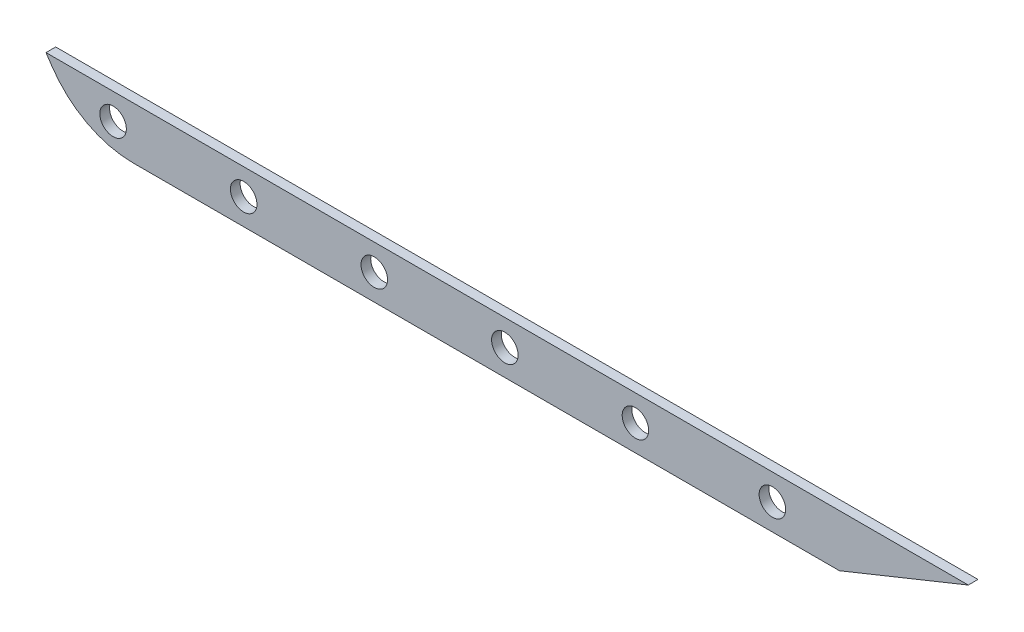
ISO-10303-21;
HEADER;
FILE_DESCRIPTION(('STEP AP214'),'2;1');
FILE_NAME('part.step','',(''),(''),'','','');
FILE_SCHEMA(('AUTOMOTIVE_DESIGN { 1 0 10303 214 1 1 1 1 }'));
ENDSEC;
DATA;
#1=APPLICATION_CONTEXT('core data for automotive mechanical design processes');
#2=APPLICATION_PROTOCOL_DEFINITION('international standard','automotive_design',2000,#1);
#3=PRODUCT_CONTEXT('',#1,'mechanical');
#4=PRODUCT('Part','Part','',(#3));
#5=PRODUCT_RELATED_PRODUCT_CATEGORY('part','',(#4));
#6=PRODUCT_DEFINITION_FORMATION('','',#4);
#7=PRODUCT_DEFINITION_CONTEXT('part definition',#1,'design');
#8=PRODUCT_DEFINITION('design','',#6,#7);
#9=PRODUCT_DEFINITION_SHAPE('','',#8);
#10=(LENGTH_UNIT() NAMED_UNIT(*) SI_UNIT(.MILLI.,.METRE.));
#11=(NAMED_UNIT(*) PLANE_ANGLE_UNIT() SI_UNIT($,.RADIAN.));
#12=(NAMED_UNIT(*) SI_UNIT($,.STERADIAN.) SOLID_ANGLE_UNIT());
#13=UNCERTAINTY_MEASURE_WITH_UNIT(LENGTH_MEASURE(1.E-05),#10,'distance_accuracy_value','');
#14=(GEOMETRIC_REPRESENTATION_CONTEXT(3) GLOBAL_UNCERTAINTY_ASSIGNED_CONTEXT((#13)) GLOBAL_UNIT_ASSIGNED_CONTEXT((#10,
#11,#12)) REPRESENTATION_CONTEXT('',''));
#15=CARTESIAN_POINT('',(0.,0.,0.));
#16=DIRECTION('',(0.,0.,1.));
#17=DIRECTION('',(1.,0.,0.));
#18=AXIS2_PLACEMENT_3D('',#15,#16,#17);
#19=CARTESIAN_POINT('',(-98.8794117647059,3.85098039215685,4.7625));
#20=DIRECTION('',(0.832050294337844,0.554700196225229,0.));
#21=DIRECTION('',(-0.554700196225229,0.832050294337844,0.));
#22=AXIS2_PLACEMENT_3D('',#19,#20,#21);
#23=PLANE('',#22);
#24=DIRECTION('',(0.554700196225229,-0.832050294337844,0.));
#25=VECTOR('',#24,1.);
#26=CARTESIAN_POINT('',(-98.8794117647059,3.85098039215685,0.));
#27=LINE('',#26,#25);
#28=CARTESIAN_POINT('',(-48.8794117647059,-71.1490196078431,0.));
#29=VERTEX_POINT('',#28);
#30=CARTESIAN_POINT('',(-46.1290054854985,-75.2746290266542,0.));
#31=VERTEX_POINT('',#30);
#32=EDGE_CURVE('E156',#29,#31,#27,.T.);
#33=ORIENTED_EDGE('',*,*,#32,.T.);
#34=DIRECTION('',(0.,0.,-1.));
#35=VECTOR('',#34,1.);
#36=CARTESIAN_POINT('',(-46.1290054854985,-75.2746290266542,4.7625));
#37=LINE('',#36,#35);
#38=CARTESIAN_POINT('',(-46.1290054854985,-75.2746290266542,4.7625));
#39=VERTEX_POINT('',#38);
#40=EDGE_CURVE('E49',#31,#39,#37,.F.);
#41=ORIENTED_EDGE('',*,*,#40,.T.);
#42=DIRECTION('',(0.554700196225229,-0.832050294337844,0.));
#43=VECTOR('',#42,1.);
#44=CARTESIAN_POINT('',(-98.8794117647059,3.85098039215685,4.7625));
#45=LINE('',#44,#43);
#46=CARTESIAN_POINT('',(-48.8794117647059,-71.1490196078431,4.7625));
#47=VERTEX_POINT('',#46);
#48=EDGE_CURVE('E98',#47,#39,#45,.T.);
#49=ORIENTED_EDGE('',*,*,#48,.F.);
#50=DIRECTION('',(0.,0.,1.));
#51=VECTOR('',#50,1.);
#52=CARTESIAN_POINT('',(-48.8794117647059,-71.1490196078431,-5.2375));
#53=LINE('',#52,#51);
#54=EDGE_CURVE('E112',#29,#47,#53,.T.);
#55=ORIENTED_EDGE('',*,*,#54,.F.);
#56=EDGE_LOOP('',(#33,#41,#49,#55));
#57=FACE_BOUND('',#56,.T.);
#58=ADVANCED_FACE('F41',(#57),#23,.F.);
#59=CARTESIAN_POINT('',(-31.8794117647059,-96.6490196078432,4.7625));
#60=DIRECTION('',(0.,1.,0.));
#61=DIRECTION('',(-1.,0.,0.));
#62=AXIS2_PLACEMENT_3D('',#59,#60,#61);
#63=PLANE('',#62);
#64=DIRECTION('',(1.,0.,0.));
#65=VECTOR('',#64,1.);
#66=CARTESIAN_POINT('',(-31.8794117647059,-96.6490196078432,0.));
#67=LINE('',#66,#65);
#68=CARTESIAN_POINT('',(-6.19059135728204,-96.6490196078432,0.));
#69=VERTEX_POINT('',#68);
#70=CARTESIAN_POINT('',(340.005873473177,-96.6490196078432,0.));
#71=VERTEX_POINT('',#70);
#72=EDGE_CURVE('E122',#69,#71,#67,.T.);
#73=ORIENTED_EDGE('',*,*,#72,.T.);
#74=DIRECTION('',(0.,0.,1.));
#75=VECTOR('',#74,1.);
#76=CARTESIAN_POINT('',(340.005873473177,-96.6490196078432,-5.2375));
#77=LINE('',#76,#75);
#78=CARTESIAN_POINT('',(340.005873473177,-96.6490196078432,4.7625));
#79=VERTEX_POINT('',#78);
#80=EDGE_CURVE('E108',#71,#79,#77,.T.);
#81=ORIENTED_EDGE('',*,*,#80,.T.);
#82=DIRECTION('',(1.,0.,0.));
#83=VECTOR('',#82,1.);
#84=CARTESIAN_POINT('',(-31.8794117647059,-96.6490196078432,4.7625));
#85=LINE('',#84,#83);
#86=CARTESIAN_POINT('',(-6.19059135728204,-96.6490196078432,4.7625));
#87=VERTEX_POINT('',#86);
#88=EDGE_CURVE('E107',#87,#79,#85,.T.);
#89=ORIENTED_EDGE('',*,*,#88,.F.);
#90=DIRECTION('',(0.,0.,-1.));
#91=VECTOR('',#90,1.);
#92=CARTESIAN_POINT('',(-6.19059135728204,-96.6490196078432,4.7625));
#93=LINE('',#92,#91);
#94=EDGE_CURVE('E162',#87,#69,#93,.T.);
#95=ORIENTED_EDGE('',*,*,#94,.T.);
#96=EDGE_LOOP('',(#73,#81,#89,#95));
#97=FACE_BOUND('',#96,.T.);
#98=ADVANCED_FACE('F167',(#97),#63,.F.);
#99=CARTESIAN_POINT('',(0.,0.,4.7625));
#100=DIRECTION('',(0.,0.,1.));
#101=DIRECTION('',(1.,0.,0.));
#102=AXIS2_PLACEMENT_3D('',#99,#100,#101);
#103=PLANE('',#102);
#104=DIRECTION('',(-0.92718385456679,-0.374606593415906,0.));
#105=VECTOR('',#104,1.);
#106=CARTESIAN_POINT('',(403.120588235294,-71.1490196078431,4.7625));
#107=LINE('',#106,#105);
#108=CARTESIAN_POINT('',(403.120588235294,-71.1490196078431,4.7625));
#109=VERTEX_POINT('',#108);
#110=EDGE_CURVE('E90',#109,#79,#107,.T.);
#111=ORIENTED_EDGE('',*,*,#110,.F.);
#112=DIRECTION('',(1.,0.,0.));
#113=VECTOR('',#112,1.);
#114=CARTESIAN_POINT('',(-48.8794117647059,-71.1490196078431,4.7625));
#115=LINE('',#114,#113);
#116=EDGE_CURVE('E105',#47,#109,#115,.T.);
#117=ORIENTED_EDGE('',*,*,#116,.F.);
#118=ORIENTED_EDGE('',*,*,#48,.T.);
#119=CARTESIAN_POINT('',(-6.19059135728204,-48.6490196078432,4.7625));
#120=DIRECTION('',(0.,0.,1.));
#121=DIRECTION('',(1.,0.,0.));
#122=AXIS2_PLACEMENT_3D('',#119,#120,#121);
#123=CIRCLE('',#122,48.);
#124=EDGE_CURVE('E11',#39,#87,#123,.T.);
#125=ORIENTED_EDGE('',*,*,#124,.T.);
#126=ORIENTED_EDGE('',*,*,#88,.T.);
#127=EDGE_LOOP('',(#111,#117,#118,#125,#126));
#128=FACE_BOUND('',#127,.T.);
#129=CARTESIAN_POINT('',(-16.,-83.8990196078432,4.7625));
#130=DIRECTION('',(0.,0.,1.));
#131=DIRECTION('',(1.,0.,0.));
#132=AXIS2_PLACEMENT_3D('',#129,#130,#131);
#133=CIRCLE('',#132,6.50000000000001);
#134=CARTESIAN_POINT('',(-22.5,-83.8990196078432,4.7625));
#135=VERTEX_POINT('',#134);
#136=EDGE_CURVE('E119',#135,#135,#133,.T.);
#137=ORIENTED_EDGE('',*,*,#136,.F.);
#138=EDGE_LOOP('',(#137));
#139=FACE_BOUND('',#138,.T.);
#140=CARTESIAN_POINT('',(48.,-83.8990196078433,4.7625));
#141=DIRECTION('',(0.,0.,1.));
#142=DIRECTION('',(1.,0.,0.));
#143=AXIS2_PLACEMENT_3D('',#140,#141,#142);
#144=CIRCLE('',#143,6.50000000000001);
#145=CARTESIAN_POINT('',(41.5,-83.8990196078433,4.7625));
#146=VERTEX_POINT('',#145);
#147=EDGE_CURVE('E129',#146,#146,#144,.T.);
#148=ORIENTED_EDGE('',*,*,#147,.F.);
#149=EDGE_LOOP('',(#148));
#150=FACE_BOUND('',#149,.T.);
#151=CARTESIAN_POINT('',(112.,-83.8990196078432,4.7625));
#152=DIRECTION('',(0.,0.,1.));
#153=DIRECTION('',(1.,0.,0.));
#154=AXIS2_PLACEMENT_3D('',#151,#152,#153);
#155=CIRCLE('',#154,6.50000000000002);
#156=CARTESIAN_POINT('',(105.5,-83.8990196078432,4.7625));
#157=VERTEX_POINT('',#156);
#158=EDGE_CURVE('E135',#157,#157,#155,.T.);
#159=ORIENTED_EDGE('',*,*,#158,.F.);
#160=EDGE_LOOP('',(#159));
#161=FACE_BOUND('',#160,.T.);
#162=CARTESIAN_POINT('',(176.,-83.8990196078432,4.7625));
#163=DIRECTION('',(0.,0.,1.));
#164=DIRECTION('',(1.,0.,0.));
#165=AXIS2_PLACEMENT_3D('',#162,#163,#164);
#166=CIRCLE('',#165,6.50000000000002);
#167=CARTESIAN_POINT('',(169.5,-83.8990196078432,4.7625));
#168=VERTEX_POINT('',#167);
#169=EDGE_CURVE('E141',#168,#168,#166,.T.);
#170=ORIENTED_EDGE('',*,*,#169,.F.);
#171=EDGE_LOOP('',(#170));
#172=FACE_BOUND('',#171,.T.);
#173=CARTESIAN_POINT('',(240.,-83.8990196078432,4.7625));
#174=DIRECTION('',(0.,0.,1.));
#175=DIRECTION('',(1.,0.,0.));
#176=AXIS2_PLACEMENT_3D('',#173,#174,#175);
#177=CIRCLE('',#176,6.50000000000002);
#178=CARTESIAN_POINT('',(233.5,-83.8990196078432,4.7625));
#179=VERTEX_POINT('',#178);
#180=EDGE_CURVE('E147',#179,#179,#177,.T.);
#181=ORIENTED_EDGE('',*,*,#180,.F.);
#182=EDGE_LOOP('',(#181));
#183=FACE_BOUND('',#182,.T.);
#184=CARTESIAN_POINT('',(307.120588235294,-83.8990196078432,4.7625));
#185=DIRECTION('',(0.,0.,1.));
#186=DIRECTION('',(1.,0.,0.));
#187=AXIS2_PLACEMENT_3D('',#184,#185,#186);
#188=CIRCLE('',#187,6.50000000000002);
#189=CARTESIAN_POINT('',(300.620588235294,-83.8990196078432,4.7625));
#190=VERTEX_POINT('',#189);
#191=EDGE_CURVE('E114',#190,#190,#188,.T.);
#192=ORIENTED_EDGE('',*,*,#191,.F.);
#193=EDGE_LOOP('',(#192));
#194=FACE_BOUND('',#193,.T.);
#195=ADVANCED_FACE('F103',(#128,#139,#150,#161,#172,#183,#194),#103,.T.);
#196=CARTESIAN_POINT('',(0.,0.,0.));
#197=DIRECTION('',(0.,0.,1.));
#198=DIRECTION('',(1.,0.,0.));
#199=AXIS2_PLACEMENT_3D('',#196,#197,#198);
#200=PLANE('',#199);
#201=CARTESIAN_POINT('',(-16.,-83.8990196078432,0.));
#202=DIRECTION('',(0.,0.,1.));
#203=DIRECTION('',(1.,0.,0.));
#204=AXIS2_PLACEMENT_3D('',#201,#202,#203);
#205=CIRCLE('',#204,6.50000000000001);
#206=CARTESIAN_POINT('',(-22.5,-83.8990196078432,0.));
#207=VERTEX_POINT('',#206);
#208=EDGE_CURVE('E123',#207,#207,#205,.T.);
#209=ORIENTED_EDGE('',*,*,#208,.T.);
#210=EDGE_LOOP('',(#209));
#211=FACE_BOUND('',#210,.T.);
#212=CARTESIAN_POINT('',(48.,-83.8990196078433,0.));
#213=DIRECTION('',(0.,0.,1.));
#214=DIRECTION('',(1.,0.,0.));
#215=AXIS2_PLACEMENT_3D('',#212,#213,#214);
#216=CIRCLE('',#215,6.50000000000001);
#217=CARTESIAN_POINT('',(41.5,-83.8990196078433,0.));
#218=VERTEX_POINT('',#217);
#219=EDGE_CURVE('E126',#218,#218,#216,.T.);
#220=ORIENTED_EDGE('',*,*,#219,.T.);
#221=EDGE_LOOP('',(#220));
#222=FACE_BOUND('',#221,.T.);
#223=CARTESIAN_POINT('',(112.,-83.8990196078432,0.));
#224=DIRECTION('',(0.,0.,1.));
#225=DIRECTION('',(1.,0.,0.));
#226=AXIS2_PLACEMENT_3D('',#223,#224,#225);
#227=CIRCLE('',#226,6.50000000000002);
#228=CARTESIAN_POINT('',(105.5,-83.8990196078432,0.));
#229=VERTEX_POINT('',#228);
#230=EDGE_CURVE('E132',#229,#229,#227,.T.);
#231=ORIENTED_EDGE('',*,*,#230,.T.);
#232=EDGE_LOOP('',(#231));
#233=FACE_BOUND('',#232,.T.);
#234=CARTESIAN_POINT('',(176.,-83.8990196078432,0.));
#235=DIRECTION('',(0.,0.,1.));
#236=DIRECTION('',(1.,0.,0.));
#237=AXIS2_PLACEMENT_3D('',#234,#235,#236);
#238=CIRCLE('',#237,6.50000000000002);
#239=CARTESIAN_POINT('',(169.5,-83.8990196078432,0.));
#240=VERTEX_POINT('',#239);
#241=EDGE_CURVE('E138',#240,#240,#238,.T.);
#242=ORIENTED_EDGE('',*,*,#241,.T.);
#243=EDGE_LOOP('',(#242));
#244=FACE_BOUND('',#243,.T.);
#245=CARTESIAN_POINT('',(240.,-83.8990196078432,0.));
#246=DIRECTION('',(0.,0.,1.));
#247=DIRECTION('',(1.,0.,0.));
#248=AXIS2_PLACEMENT_3D('',#245,#246,#247);
#249=CIRCLE('',#248,6.50000000000002);
#250=CARTESIAN_POINT('',(233.5,-83.8990196078432,0.));
#251=VERTEX_POINT('',#250);
#252=EDGE_CURVE('E144',#251,#251,#249,.T.);
#253=ORIENTED_EDGE('',*,*,#252,.T.);
#254=EDGE_LOOP('',(#253));
#255=FACE_BOUND('',#254,.T.);
#256=CARTESIAN_POINT('',(307.120588235294,-83.8990196078432,0.));
#257=DIRECTION('',(0.,0.,1.));
#258=DIRECTION('',(1.,0.,0.));
#259=AXIS2_PLACEMENT_3D('',#256,#257,#258);
#260=CIRCLE('',#259,6.50000000000002);
#261=CARTESIAN_POINT('',(300.620588235294,-83.8990196078432,0.));
#262=VERTEX_POINT('',#261);
#263=EDGE_CURVE('E150',#262,#262,#260,.T.);
#264=ORIENTED_EDGE('',*,*,#263,.T.);
#265=EDGE_LOOP('',(#264));
#266=FACE_BOUND('',#265,.T.);
#267=DIRECTION('',(1.,0.,0.));
#268=VECTOR('',#267,1.);
#269=CARTESIAN_POINT('',(0.,-71.1490196078431,0.));
#270=LINE('',#269,#268);
#271=CARTESIAN_POINT('',(403.120588235294,-71.1490196078431,0.));
#272=VERTEX_POINT('',#271);
#273=EDGE_CURVE('E97',#29,#272,#270,.T.);
#274=ORIENTED_EDGE('',*,*,#273,.T.);
#275=DIRECTION('',(-0.92718385456679,-0.374606593415906,0.));
#276=VECTOR('',#275,1.);
#277=CARTESIAN_POINT('',(81.2820834011268,-201.180216044419,0.));
#278=LINE('',#277,#276);
#279=EDGE_CURVE('E93',#272,#71,#278,.T.);
#280=ORIENTED_EDGE('',*,*,#279,.T.);
#281=ORIENTED_EDGE('',*,*,#72,.F.);
#282=CARTESIAN_POINT('',(-6.19059135728204,-48.6490196078432,0.));
#283=DIRECTION('',(0.,0.,1.));
#284=DIRECTION('',(1.,0.,0.));
#285=AXIS2_PLACEMENT_3D('',#282,#283,#284);
#286=CIRCLE('',#285,48.);
#287=EDGE_CURVE('E63',#69,#31,#286,.F.);
#288=ORIENTED_EDGE('',*,*,#287,.T.);
#289=ORIENTED_EDGE('',*,*,#32,.F.);
#290=EDGE_LOOP('',(#274,#280,#281,#288,#289));
#291=FACE_BOUND('',#290,.T.);
#292=ADVANCED_FACE('F170',(#211,#222,#233,#244,#255,#266,#291),#200,.F.);
#293=CARTESIAN_POINT('',(307.120588235294,-83.8990196078432,4.7625));
#294=DIRECTION('',(0.,0.,-1.));
#295=DIRECTION('',(-1.,0.,0.));
#296=AXIS2_PLACEMENT_3D('',#293,#294,#295);
#297=CYLINDRICAL_SURFACE('',#296,6.50000000000002);
#298=CARTESIAN_POINT('',(300.620588235294,-83.8990196078432,4.7625));
#299=CARTESIAN_POINT('',(300.620588235294,-83.8990196078432,4.712890625));
#300=CARTESIAN_POINT('',(300.620588235294,-83.8990196078432,4.66328125));
#301=CARTESIAN_POINT('',(300.620588235294,-83.8990196078432,4.5640625));
#302=CARTESIAN_POINT('',(300.620588235294,-83.8990196078432,4.514453125));
#303=CARTESIAN_POINT('',(300.620588235294,-83.8990196078432,4.415234375));
#304=CARTESIAN_POINT('',(300.620588235294,-83.8990196078432,4.365625));
#305=CARTESIAN_POINT('',(300.620588235294,-83.8990196078432,4.26640625));
#306=CARTESIAN_POINT('',(300.620588235294,-83.8990196078432,4.216796875));
#307=CARTESIAN_POINT('',(300.620588235294,-83.8990196078432,4.117578125));
#308=CARTESIAN_POINT('',(300.620588235294,-83.8990196078432,4.06796875));
#309=CARTESIAN_POINT('',(300.620588235294,-83.8990196078432,3.96875));
#310=CARTESIAN_POINT('',(300.620588235294,-83.8990196078432,3.919140625));
#311=CARTESIAN_POINT('',(300.620588235294,-83.8990196078432,3.819921875));
#312=CARTESIAN_POINT('',(300.620588235294,-83.8990196078432,3.7703125));
#313=CARTESIAN_POINT('',(300.620588235294,-83.8990196078432,3.67109375));
#314=CARTESIAN_POINT('',(300.620588235294,-83.8990196078432,3.621484375));
#315=CARTESIAN_POINT('',(300.620588235294,-83.8990196078432,3.522265625));
#316=CARTESIAN_POINT('',(300.620588235294,-83.8990196078432,3.47265625));
#317=CARTESIAN_POINT('',(300.620588235294,-83.8990196078432,3.3734375));
#318=CARTESIAN_POINT('',(300.620588235294,-83.8990196078432,3.323828125));
#319=CARTESIAN_POINT('',(300.620588235294,-83.8990196078432,3.224609375));
#320=CARTESIAN_POINT('',(300.620588235294,-83.8990196078432,3.175));
#321=CARTESIAN_POINT('',(300.620588235294,-83.8990196078432,3.07578125));
#322=CARTESIAN_POINT('',(300.620588235294,-83.8990196078432,3.026171875));
#323=CARTESIAN_POINT('',(300.620588235294,-83.8990196078432,2.926953125));
#324=CARTESIAN_POINT('',(300.620588235294,-83.8990196078432,2.87734375));
#325=CARTESIAN_POINT('',(300.620588235294,-83.8990196078432,2.778125));
#326=CARTESIAN_POINT('',(300.620588235294,-83.8990196078432,2.728515625));
#327=CARTESIAN_POINT('',(300.620588235294,-83.8990196078432,2.629296875));
#328=CARTESIAN_POINT('',(300.620588235294,-83.8990196078432,2.5796875));
#329=CARTESIAN_POINT('',(300.620588235294,-83.8990196078432,2.48046875));
#330=CARTESIAN_POINT('',(300.620588235294,-83.8990196078432,2.430859375));
#331=CARTESIAN_POINT('',(300.620588235294,-83.8990196078432,2.331640625));
#332=CARTESIAN_POINT('',(300.620588235294,-83.8990196078432,2.28203125));
#333=CARTESIAN_POINT('',(300.620588235294,-83.8990196078432,2.1828125));
#334=CARTESIAN_POINT('',(300.620588235294,-83.8990196078432,2.133203125));
#335=CARTESIAN_POINT('',(300.620588235294,-83.8990196078432,2.033984375));
#336=CARTESIAN_POINT('',(300.620588235294,-83.8990196078432,1.984375));
#337=CARTESIAN_POINT('',(300.620588235294,-83.8990196078432,1.88515625));
#338=CARTESIAN_POINT('',(300.620588235294,-83.8990196078432,1.835546875));
#339=CARTESIAN_POINT('',(300.620588235294,-83.8990196078432,1.736328125));
#340=CARTESIAN_POINT('',(300.620588235294,-83.8990196078432,1.68671875));
#341=CARTESIAN_POINT('',(300.620588235294,-83.8990196078432,1.5875));
#342=CARTESIAN_POINT('',(300.620588235294,-83.8990196078432,1.537890625));
#343=CARTESIAN_POINT('',(300.620588235294,-83.8990196078432,1.438671875));
#344=CARTESIAN_POINT('',(300.620588235294,-83.8990196078432,1.3890625));
#345=CARTESIAN_POINT('',(300.620588235294,-83.8990196078432,1.28984375));
#346=CARTESIAN_POINT('',(300.620588235294,-83.8990196078432,1.240234375));
#347=CARTESIAN_POINT('',(300.620588235294,-83.8990196078432,1.141015625));
#348=CARTESIAN_POINT('',(300.620588235294,-83.8990196078432,1.09140625));
#349=CARTESIAN_POINT('',(300.620588235294,-83.8990196078432,0.992187499999999));
#350=CARTESIAN_POINT('',(300.620588235294,-83.8990196078432,0.942578124999999));
#351=CARTESIAN_POINT('',(300.620588235294,-83.8990196078432,0.843359375));
#352=CARTESIAN_POINT('',(300.620588235294,-83.8990196078432,0.79375));
#353=CARTESIAN_POINT('',(300.620588235294,-83.8990196078432,0.69453125));
#354=CARTESIAN_POINT('',(300.620588235294,-83.8990196078432,0.644921875));
#355=CARTESIAN_POINT('',(300.620588235294,-83.8990196078432,0.545703125));
#356=CARTESIAN_POINT('',(300.620588235294,-83.8990196078432,0.49609375));
#357=CARTESIAN_POINT('',(300.620588235294,-83.8990196078432,0.396875));
#358=CARTESIAN_POINT('',(300.620588235294,-83.8990196078432,0.347265625));
#359=CARTESIAN_POINT('',(300.620588235294,-83.8990196078432,0.248046875));
#360=CARTESIAN_POINT('',(300.620588235294,-83.8990196078432,0.1984375));
#361=CARTESIAN_POINT('',(300.620588235294,-83.8990196078432,0.09921875));
#362=CARTESIAN_POINT('',(300.620588235294,-83.8990196078432,0.049609375));
#363=CARTESIAN_POINT('',(300.620588235294,-83.8990196078432,0.));
#364=B_SPLINE_CURVE_WITH_KNOTS('',3,(#298,#299,#300,#301,#302,#303,#304,#305,#306,#307,#308,
#309,#310,#311,#312,#313,#314,#315,#316,#317,#318,#319,#320,#321,#322,#323,#324,#325,#326,#327,
#328,#329,#330,#331,#332,#333,#334,#335,#336,#337,#338,#339,#340,#341,#342,#343,#344,#345,#346,
#347,#348,#349,#350,#351,#352,#353,#354,#355,#356,#357,#358,#359,#360,#361,#362,#363),
.UNSPECIFIED.,.F.,.F.,(4,2,2,2,2,2,2,2,2,2,2,2,2,2,2,2,2,2,2,2,2,2,2,2,2,2,2,2,2,2,2,2,4),(0.,
0.148828125,0.29765625,0.446484375,0.5953125,0.744140625,0.892968750000001,1.041796875,1.190625,
1.339453125,1.48828125,1.637109375,1.7859375,1.934765625,2.08359375,2.232421875,2.38125,
2.530078125,2.67890625,2.827734375,2.9765625,3.125390625,3.27421875,3.423046875,3.571875,
3.720703125,3.86953125,4.018359375,4.1671875,4.316015625,4.46484375,4.613671875,4.7625),.UNSPECIFIED.);
#365=EDGE_CURVE('BSEAM188',#190,#262,#364,.T.);
#366=ORIENTED_EDGE('',*,*,#191,.T.);
#367=ORIENTED_EDGE('',*,*,#263,.F.);
#368=ORIENTED_EDGE('',*,*,#365,.T.);
#369=ORIENTED_EDGE('',*,*,#365,.F.);
#370=EDGE_LOOP('',(#366,#368,#367,#369));
#371=FACE_BOUND('',#370,.T.);
#372=ADVANCED_FACE('F188',(#371),#297,.F.);
#373=CARTESIAN_POINT('',(240.,-83.8990196078432,4.7625));
#374=DIRECTION('',(0.,0.,-1.));
#375=DIRECTION('',(-1.,0.,0.));
#376=AXIS2_PLACEMENT_3D('',#373,#374,#375);
#377=CYLINDRICAL_SURFACE('',#376,6.50000000000002);
#378=CARTESIAN_POINT('',(233.5,-83.8990196078432,4.7625));
#379=CARTESIAN_POINT('',(233.5,-83.8990196078432,4.712890625));
#380=CARTESIAN_POINT('',(233.5,-83.8990196078432,4.66328125));
#381=CARTESIAN_POINT('',(233.5,-83.8990196078432,4.5640625));
#382=CARTESIAN_POINT('',(233.5,-83.8990196078432,4.514453125));
#383=CARTESIAN_POINT('',(233.5,-83.8990196078432,4.415234375));
#384=CARTESIAN_POINT('',(233.5,-83.8990196078432,4.365625));
#385=CARTESIAN_POINT('',(233.5,-83.8990196078432,4.26640625));
#386=CARTESIAN_POINT('',(233.5,-83.8990196078432,4.216796875));
#387=CARTESIAN_POINT('',(233.5,-83.8990196078432,4.117578125));
#388=CARTESIAN_POINT('',(233.5,-83.8990196078432,4.06796875));
#389=CARTESIAN_POINT('',(233.5,-83.8990196078432,3.96875));
#390=CARTESIAN_POINT('',(233.5,-83.8990196078432,3.919140625));
#391=CARTESIAN_POINT('',(233.5,-83.8990196078432,3.819921875));
#392=CARTESIAN_POINT('',(233.5,-83.8990196078432,3.7703125));
#393=CARTESIAN_POINT('',(233.5,-83.8990196078432,3.67109375));
#394=CARTESIAN_POINT('',(233.5,-83.8990196078432,3.621484375));
#395=CARTESIAN_POINT('',(233.5,-83.8990196078432,3.522265625));
#396=CARTESIAN_POINT('',(233.5,-83.8990196078432,3.47265625));
#397=CARTESIAN_POINT('',(233.5,-83.8990196078432,3.3734375));
#398=CARTESIAN_POINT('',(233.5,-83.8990196078432,3.323828125));
#399=CARTESIAN_POINT('',(233.5,-83.8990196078432,3.224609375));
#400=CARTESIAN_POINT('',(233.5,-83.8990196078432,3.175));
#401=CARTESIAN_POINT('',(233.5,-83.8990196078432,3.07578125));
#402=CARTESIAN_POINT('',(233.5,-83.8990196078432,3.026171875));
#403=CARTESIAN_POINT('',(233.5,-83.8990196078432,2.926953125));
#404=CARTESIAN_POINT('',(233.5,-83.8990196078432,2.87734375));
#405=CARTESIAN_POINT('',(233.5,-83.8990196078432,2.778125));
#406=CARTESIAN_POINT('',(233.5,-83.8990196078432,2.728515625));
#407=CARTESIAN_POINT('',(233.5,-83.8990196078432,2.629296875));
#408=CARTESIAN_POINT('',(233.5,-83.8990196078432,2.5796875));
#409=CARTESIAN_POINT('',(233.5,-83.8990196078432,2.48046875));
#410=CARTESIAN_POINT('',(233.5,-83.8990196078432,2.430859375));
#411=CARTESIAN_POINT('',(233.5,-83.8990196078432,2.331640625));
#412=CARTESIAN_POINT('',(233.5,-83.8990196078432,2.28203125));
#413=CARTESIAN_POINT('',(233.5,-83.8990196078432,2.1828125));
#414=CARTESIAN_POINT('',(233.5,-83.8990196078432,2.133203125));
#415=CARTESIAN_POINT('',(233.5,-83.8990196078432,2.033984375));
#416=CARTESIAN_POINT('',(233.5,-83.8990196078432,1.984375));
#417=CARTESIAN_POINT('',(233.5,-83.8990196078432,1.88515625));
#418=CARTESIAN_POINT('',(233.5,-83.8990196078432,1.835546875));
#419=CARTESIAN_POINT('',(233.5,-83.8990196078432,1.736328125));
#420=CARTESIAN_POINT('',(233.5,-83.8990196078432,1.68671875));
#421=CARTESIAN_POINT('',(233.5,-83.8990196078432,1.5875));
#422=CARTESIAN_POINT('',(233.5,-83.8990196078432,1.537890625));
#423=CARTESIAN_POINT('',(233.5,-83.8990196078432,1.438671875));
#424=CARTESIAN_POINT('',(233.5,-83.8990196078432,1.3890625));
#425=CARTESIAN_POINT('',(233.5,-83.8990196078432,1.28984375));
#426=CARTESIAN_POINT('',(233.5,-83.8990196078432,1.240234375));
#427=CARTESIAN_POINT('',(233.5,-83.8990196078432,1.141015625));
#428=CARTESIAN_POINT('',(233.5,-83.8990196078432,1.09140625));
#429=CARTESIAN_POINT('',(233.5,-83.8990196078432,0.992187499999999));
#430=CARTESIAN_POINT('',(233.5,-83.8990196078432,0.942578124999999));
#431=CARTESIAN_POINT('',(233.5,-83.8990196078432,0.843359375));
#432=CARTESIAN_POINT('',(233.5,-83.8990196078432,0.79375));
#433=CARTESIAN_POINT('',(233.5,-83.8990196078432,0.69453125));
#434=CARTESIAN_POINT('',(233.5,-83.8990196078432,0.644921875));
#435=CARTESIAN_POINT('',(233.5,-83.8990196078432,0.545703125));
#436=CARTESIAN_POINT('',(233.5,-83.8990196078432,0.49609375));
#437=CARTESIAN_POINT('',(233.5,-83.8990196078432,0.396875));
#438=CARTESIAN_POINT('',(233.5,-83.8990196078432,0.347265625));
#439=CARTESIAN_POINT('',(233.5,-83.8990196078432,0.248046875));
#440=CARTESIAN_POINT('',(233.5,-83.8990196078432,0.1984375));
#441=CARTESIAN_POINT('',(233.5,-83.8990196078432,0.09921875));
#442=CARTESIAN_POINT('',(233.5,-83.8990196078432,0.049609375));
#443=CARTESIAN_POINT('',(233.5,-83.8990196078432,0.));
#444=B_SPLINE_CURVE_WITH_KNOTS('',3,(#378,#379,#380,#381,#382,#383,#384,#385,#386,#387,#388,
#389,#390,#391,#392,#393,#394,#395,#396,#397,#398,#399,#400,#401,#402,#403,#404,#405,#406,#407,
#408,#409,#410,#411,#412,#413,#414,#415,#416,#417,#418,#419,#420,#421,#422,#423,#424,#425,#426,
#427,#428,#429,#430,#431,#432,#433,#434,#435,#436,#437,#438,#439,#440,#441,#442,#443),
.UNSPECIFIED.,.F.,.F.,(4,2,2,2,2,2,2,2,2,2,2,2,2,2,2,2,2,2,2,2,2,2,2,2,2,2,2,2,2,2,2,2,4),(0.,
0.148828125,0.29765625,0.446484375,0.5953125,0.744140625,0.892968750000001,1.041796875,1.190625,
1.339453125,1.48828125,1.637109375,1.7859375,1.934765625,2.08359375,2.232421875,2.38125,
2.530078125,2.67890625,2.827734375,2.9765625,3.125390625,3.27421875,3.423046875,3.571875,
3.720703125,3.86953125,4.018359375,4.1671875,4.316015625,4.46484375,4.613671875,4.7625),.UNSPECIFIED.);
#445=EDGE_CURVE('BSEAM194',#179,#251,#444,.T.);
#446=ORIENTED_EDGE('',*,*,#180,.T.);
#447=ORIENTED_EDGE('',*,*,#252,.F.);
#448=ORIENTED_EDGE('',*,*,#445,.T.);
#449=ORIENTED_EDGE('',*,*,#445,.F.);
#450=EDGE_LOOP('',(#446,#448,#447,#449));
#451=FACE_BOUND('',#450,.T.);
#452=ADVANCED_FACE('F194',(#451),#377,.F.);
#453=CARTESIAN_POINT('',(176.,-83.8990196078432,4.7625));
#454=DIRECTION('',(0.,0.,-1.));
#455=DIRECTION('',(-1.,0.,0.));
#456=AXIS2_PLACEMENT_3D('',#453,#454,#455);
#457=CYLINDRICAL_SURFACE('',#456,6.50000000000002);
#458=CARTESIAN_POINT('',(169.5,-83.8990196078432,4.7625));
#459=CARTESIAN_POINT('',(169.5,-83.8990196078432,4.712890625));
#460=CARTESIAN_POINT('',(169.5,-83.8990196078432,4.66328125));
#461=CARTESIAN_POINT('',(169.5,-83.8990196078432,4.5640625));
#462=CARTESIAN_POINT('',(169.5,-83.8990196078432,4.514453125));
#463=CARTESIAN_POINT('',(169.5,-83.8990196078432,4.415234375));
#464=CARTESIAN_POINT('',(169.5,-83.8990196078432,4.365625));
#465=CARTESIAN_POINT('',(169.5,-83.8990196078432,4.26640625));
#466=CARTESIAN_POINT('',(169.5,-83.8990196078432,4.216796875));
#467=CARTESIAN_POINT('',(169.5,-83.8990196078432,4.117578125));
#468=CARTESIAN_POINT('',(169.5,-83.8990196078432,4.06796875));
#469=CARTESIAN_POINT('',(169.5,-83.8990196078432,3.96875));
#470=CARTESIAN_POINT('',(169.5,-83.8990196078432,3.919140625));
#471=CARTESIAN_POINT('',(169.5,-83.8990196078432,3.819921875));
#472=CARTESIAN_POINT('',(169.5,-83.8990196078432,3.7703125));
#473=CARTESIAN_POINT('',(169.5,-83.8990196078432,3.67109375));
#474=CARTESIAN_POINT('',(169.5,-83.8990196078432,3.621484375));
#475=CARTESIAN_POINT('',(169.5,-83.8990196078432,3.522265625));
#476=CARTESIAN_POINT('',(169.5,-83.8990196078432,3.47265625));
#477=CARTESIAN_POINT('',(169.5,-83.8990196078432,3.3734375));
#478=CARTESIAN_POINT('',(169.5,-83.8990196078432,3.323828125));
#479=CARTESIAN_POINT('',(169.5,-83.8990196078432,3.224609375));
#480=CARTESIAN_POINT('',(169.5,-83.8990196078432,3.175));
#481=CARTESIAN_POINT('',(169.5,-83.8990196078432,3.07578125));
#482=CARTESIAN_POINT('',(169.5,-83.8990196078432,3.026171875));
#483=CARTESIAN_POINT('',(169.5,-83.8990196078432,2.926953125));
#484=CARTESIAN_POINT('',(169.5,-83.8990196078432,2.87734375));
#485=CARTESIAN_POINT('',(169.5,-83.8990196078432,2.778125));
#486=CARTESIAN_POINT('',(169.5,-83.8990196078432,2.728515625));
#487=CARTESIAN_POINT('',(169.5,-83.8990196078432,2.629296875));
#488=CARTESIAN_POINT('',(169.5,-83.8990196078432,2.5796875));
#489=CARTESIAN_POINT('',(169.5,-83.8990196078432,2.48046875));
#490=CARTESIAN_POINT('',(169.5,-83.8990196078432,2.430859375));
#491=CARTESIAN_POINT('',(169.5,-83.8990196078432,2.331640625));
#492=CARTESIAN_POINT('',(169.5,-83.8990196078432,2.28203125));
#493=CARTESIAN_POINT('',(169.5,-83.8990196078432,2.1828125));
#494=CARTESIAN_POINT('',(169.5,-83.8990196078432,2.133203125));
#495=CARTESIAN_POINT('',(169.5,-83.8990196078432,2.033984375));
#496=CARTESIAN_POINT('',(169.5,-83.8990196078432,1.984375));
#497=CARTESIAN_POINT('',(169.5,-83.8990196078432,1.88515625));
#498=CARTESIAN_POINT('',(169.5,-83.8990196078432,1.835546875));
#499=CARTESIAN_POINT('',(169.5,-83.8990196078432,1.736328125));
#500=CARTESIAN_POINT('',(169.5,-83.8990196078432,1.68671875));
#501=CARTESIAN_POINT('',(169.5,-83.8990196078432,1.5875));
#502=CARTESIAN_POINT('',(169.5,-83.8990196078432,1.537890625));
#503=CARTESIAN_POINT('',(169.5,-83.8990196078432,1.438671875));
#504=CARTESIAN_POINT('',(169.5,-83.8990196078432,1.3890625));
#505=CARTESIAN_POINT('',(169.5,-83.8990196078432,1.28984375));
#506=CARTESIAN_POINT('',(169.5,-83.8990196078432,1.240234375));
#507=CARTESIAN_POINT('',(169.5,-83.8990196078432,1.141015625));
#508=CARTESIAN_POINT('',(169.5,-83.8990196078432,1.09140625));
#509=CARTESIAN_POINT('',(169.5,-83.8990196078432,0.992187499999999));
#510=CARTESIAN_POINT('',(169.5,-83.8990196078432,0.942578124999999));
#511=CARTESIAN_POINT('',(169.5,-83.8990196078432,0.843359375));
#512=CARTESIAN_POINT('',(169.5,-83.8990196078432,0.79375));
#513=CARTESIAN_POINT('',(169.5,-83.8990196078432,0.69453125));
#514=CARTESIAN_POINT('',(169.5,-83.8990196078432,0.644921875));
#515=CARTESIAN_POINT('',(169.5,-83.8990196078432,0.545703125));
#516=CARTESIAN_POINT('',(169.5,-83.8990196078432,0.49609375));
#517=CARTESIAN_POINT('',(169.5,-83.8990196078432,0.396875));
#518=CARTESIAN_POINT('',(169.5,-83.8990196078432,0.347265625));
#519=CARTESIAN_POINT('',(169.5,-83.8990196078432,0.248046875));
#520=CARTESIAN_POINT('',(169.5,-83.8990196078432,0.1984375));
#521=CARTESIAN_POINT('',(169.5,-83.8990196078432,0.09921875));
#522=CARTESIAN_POINT('',(169.5,-83.8990196078432,0.049609375));
#523=CARTESIAN_POINT('',(169.5,-83.8990196078432,0.));
#524=B_SPLINE_CURVE_WITH_KNOTS('',3,(#458,#459,#460,#461,#462,#463,#464,#465,#466,#467,#468,
#469,#470,#471,#472,#473,#474,#475,#476,#477,#478,#479,#480,#481,#482,#483,#484,#485,#486,#487,
#488,#489,#490,#491,#492,#493,#494,#495,#496,#497,#498,#499,#500,#501,#502,#503,#504,#505,#506,
#507,#508,#509,#510,#511,#512,#513,#514,#515,#516,#517,#518,#519,#520,#521,#522,#523),
.UNSPECIFIED.,.F.,.F.,(4,2,2,2,2,2,2,2,2,2,2,2,2,2,2,2,2,2,2,2,2,2,2,2,2,2,2,2,2,2,2,2,4),(0.,
0.148828125,0.29765625,0.446484375,0.5953125,0.744140625,0.892968750000001,1.041796875,1.190625,
1.339453125,1.48828125,1.637109375,1.7859375,1.934765625,2.08359375,2.232421875,2.38125,
2.530078125,2.67890625,2.827734375,2.9765625,3.125390625,3.27421875,3.423046875,3.571875,
3.720703125,3.86953125,4.018359375,4.1671875,4.316015625,4.46484375,4.613671875,4.7625),.UNSPECIFIED.);
#525=EDGE_CURVE('BSEAM198',#168,#240,#524,.T.);
#526=ORIENTED_EDGE('',*,*,#169,.T.);
#527=ORIENTED_EDGE('',*,*,#241,.F.);
#528=ORIENTED_EDGE('',*,*,#525,.T.);
#529=ORIENTED_EDGE('',*,*,#525,.F.);
#530=EDGE_LOOP('',(#526,#528,#527,#529));
#531=FACE_BOUND('',#530,.T.);
#532=ADVANCED_FACE('F198',(#531),#457,.F.);
#533=CARTESIAN_POINT('',(112.,-83.8990196078432,4.7625));
#534=DIRECTION('',(0.,0.,-1.));
#535=DIRECTION('',(-1.,0.,0.));
#536=AXIS2_PLACEMENT_3D('',#533,#534,#535);
#537=CYLINDRICAL_SURFACE('',#536,6.50000000000002);
#538=CARTESIAN_POINT('',(105.5,-83.8990196078432,4.7625));
#539=CARTESIAN_POINT('',(105.5,-83.8990196078432,4.712890625));
#540=CARTESIAN_POINT('',(105.5,-83.8990196078432,4.66328125));
#541=CARTESIAN_POINT('',(105.5,-83.8990196078432,4.5640625));
#542=CARTESIAN_POINT('',(105.5,-83.8990196078432,4.514453125));
#543=CARTESIAN_POINT('',(105.5,-83.8990196078432,4.415234375));
#544=CARTESIAN_POINT('',(105.5,-83.8990196078432,4.365625));
#545=CARTESIAN_POINT('',(105.5,-83.8990196078432,4.26640625));
#546=CARTESIAN_POINT('',(105.5,-83.8990196078432,4.216796875));
#547=CARTESIAN_POINT('',(105.5,-83.8990196078432,4.117578125));
#548=CARTESIAN_POINT('',(105.5,-83.8990196078432,4.06796875));
#549=CARTESIAN_POINT('',(105.5,-83.8990196078432,3.96875));
#550=CARTESIAN_POINT('',(105.5,-83.8990196078432,3.919140625));
#551=CARTESIAN_POINT('',(105.5,-83.8990196078432,3.819921875));
#552=CARTESIAN_POINT('',(105.5,-83.8990196078432,3.7703125));
#553=CARTESIAN_POINT('',(105.5,-83.8990196078432,3.67109375));
#554=CARTESIAN_POINT('',(105.5,-83.8990196078432,3.621484375));
#555=CARTESIAN_POINT('',(105.5,-83.8990196078432,3.522265625));
#556=CARTESIAN_POINT('',(105.5,-83.8990196078432,3.47265625));
#557=CARTESIAN_POINT('',(105.5,-83.8990196078432,3.3734375));
#558=CARTESIAN_POINT('',(105.5,-83.8990196078432,3.323828125));
#559=CARTESIAN_POINT('',(105.5,-83.8990196078432,3.224609375));
#560=CARTESIAN_POINT('',(105.5,-83.8990196078432,3.175));
#561=CARTESIAN_POINT('',(105.5,-83.8990196078432,3.07578125));
#562=CARTESIAN_POINT('',(105.5,-83.8990196078432,3.026171875));
#563=CARTESIAN_POINT('',(105.5,-83.8990196078432,2.926953125));
#564=CARTESIAN_POINT('',(105.5,-83.8990196078432,2.87734375));
#565=CARTESIAN_POINT('',(105.5,-83.8990196078432,2.778125));
#566=CARTESIAN_POINT('',(105.5,-83.8990196078432,2.728515625));
#567=CARTESIAN_POINT('',(105.5,-83.8990196078432,2.629296875));
#568=CARTESIAN_POINT('',(105.5,-83.8990196078432,2.5796875));
#569=CARTESIAN_POINT('',(105.5,-83.8990196078432,2.48046875));
#570=CARTESIAN_POINT('',(105.5,-83.8990196078432,2.430859375));
#571=CARTESIAN_POINT('',(105.5,-83.8990196078432,2.331640625));
#572=CARTESIAN_POINT('',(105.5,-83.8990196078432,2.28203125));
#573=CARTESIAN_POINT('',(105.5,-83.8990196078432,2.1828125));
#574=CARTESIAN_POINT('',(105.5,-83.8990196078432,2.133203125));
#575=CARTESIAN_POINT('',(105.5,-83.8990196078432,2.033984375));
#576=CARTESIAN_POINT('',(105.5,-83.8990196078432,1.984375));
#577=CARTESIAN_POINT('',(105.5,-83.8990196078432,1.88515625));
#578=CARTESIAN_POINT('',(105.5,-83.8990196078432,1.835546875));
#579=CARTESIAN_POINT('',(105.5,-83.8990196078432,1.736328125));
#580=CARTESIAN_POINT('',(105.5,-83.8990196078432,1.68671875));
#581=CARTESIAN_POINT('',(105.5,-83.8990196078432,1.5875));
#582=CARTESIAN_POINT('',(105.5,-83.8990196078432,1.537890625));
#583=CARTESIAN_POINT('',(105.5,-83.8990196078432,1.438671875));
#584=CARTESIAN_POINT('',(105.5,-83.8990196078432,1.3890625));
#585=CARTESIAN_POINT('',(105.5,-83.8990196078432,1.28984375));
#586=CARTESIAN_POINT('',(105.5,-83.8990196078432,1.240234375));
#587=CARTESIAN_POINT('',(105.5,-83.8990196078432,1.141015625));
#588=CARTESIAN_POINT('',(105.5,-83.8990196078432,1.09140625));
#589=CARTESIAN_POINT('',(105.5,-83.8990196078432,0.992187499999999));
#590=CARTESIAN_POINT('',(105.5,-83.8990196078432,0.942578124999999));
#591=CARTESIAN_POINT('',(105.5,-83.8990196078432,0.843359375));
#592=CARTESIAN_POINT('',(105.5,-83.8990196078432,0.79375));
#593=CARTESIAN_POINT('',(105.5,-83.8990196078432,0.69453125));
#594=CARTESIAN_POINT('',(105.5,-83.8990196078432,0.644921875));
#595=CARTESIAN_POINT('',(105.5,-83.8990196078432,0.545703125));
#596=CARTESIAN_POINT('',(105.5,-83.8990196078432,0.49609375));
#597=CARTESIAN_POINT('',(105.5,-83.8990196078432,0.396875));
#598=CARTESIAN_POINT('',(105.5,-83.8990196078432,0.347265625));
#599=CARTESIAN_POINT('',(105.5,-83.8990196078432,0.248046875));
#600=CARTESIAN_POINT('',(105.5,-83.8990196078432,0.1984375));
#601=CARTESIAN_POINT('',(105.5,-83.8990196078432,0.09921875));
#602=CARTESIAN_POINT('',(105.5,-83.8990196078432,0.049609375));
#603=CARTESIAN_POINT('',(105.5,-83.8990196078432,0.));
#604=B_SPLINE_CURVE_WITH_KNOTS('',3,(#538,#539,#540,#541,#542,#543,#544,#545,#546,#547,#548,
#549,#550,#551,#552,#553,#554,#555,#556,#557,#558,#559,#560,#561,#562,#563,#564,#565,#566,#567,
#568,#569,#570,#571,#572,#573,#574,#575,#576,#577,#578,#579,#580,#581,#582,#583,#584,#585,#586,
#587,#588,#589,#590,#591,#592,#593,#594,#595,#596,#597,#598,#599,#600,#601,#602,#603),
.UNSPECIFIED.,.F.,.F.,(4,2,2,2,2,2,2,2,2,2,2,2,2,2,2,2,2,2,2,2,2,2,2,2,2,2,2,2,2,2,2,2,4),(0.,
0.148828125,0.29765625,0.446484375,0.5953125,0.744140625,0.892968750000001,1.041796875,1.190625,
1.339453125,1.48828125,1.637109375,1.7859375,1.934765625,2.08359375,2.232421875,2.38125,
2.530078125,2.67890625,2.827734375,2.9765625,3.125390625,3.27421875,3.423046875,3.571875,
3.720703125,3.86953125,4.018359375,4.1671875,4.316015625,4.46484375,4.613671875,4.7625),.UNSPECIFIED.);
#605=EDGE_CURVE('BSEAM202',#157,#229,#604,.T.);
#606=ORIENTED_EDGE('',*,*,#158,.T.);
#607=ORIENTED_EDGE('',*,*,#230,.F.);
#608=ORIENTED_EDGE('',*,*,#605,.T.);
#609=ORIENTED_EDGE('',*,*,#605,.F.);
#610=EDGE_LOOP('',(#606,#608,#607,#609));
#611=FACE_BOUND('',#610,.T.);
#612=ADVANCED_FACE('F202',(#611),#537,.F.);
#613=CARTESIAN_POINT('',(48.,-83.8990196078433,4.7625));
#614=DIRECTION('',(0.,0.,-1.));
#615=DIRECTION('',(-1.,0.,0.));
#616=AXIS2_PLACEMENT_3D('',#613,#614,#615);
#617=CYLINDRICAL_SURFACE('',#616,6.50000000000001);
#618=CARTESIAN_POINT('',(41.5,-83.8990196078433,4.7625));
#619=CARTESIAN_POINT('',(41.5,-83.8990196078433,4.712890625));
#620=CARTESIAN_POINT('',(41.5,-83.8990196078433,4.66328125));
#621=CARTESIAN_POINT('',(41.5,-83.8990196078433,4.5640625));
#622=CARTESIAN_POINT('',(41.5,-83.8990196078433,4.514453125));
#623=CARTESIAN_POINT('',(41.5,-83.8990196078433,4.415234375));
#624=CARTESIAN_POINT('',(41.5,-83.8990196078433,4.365625));
#625=CARTESIAN_POINT('',(41.5,-83.8990196078433,4.26640625));
#626=CARTESIAN_POINT('',(41.5,-83.8990196078433,4.216796875));
#627=CARTESIAN_POINT('',(41.5,-83.8990196078433,4.117578125));
#628=CARTESIAN_POINT('',(41.5,-83.8990196078433,4.06796875));
#629=CARTESIAN_POINT('',(41.5,-83.8990196078433,3.96875));
#630=CARTESIAN_POINT('',(41.5,-83.8990196078433,3.919140625));
#631=CARTESIAN_POINT('',(41.5,-83.8990196078433,3.819921875));
#632=CARTESIAN_POINT('',(41.5,-83.8990196078433,3.7703125));
#633=CARTESIAN_POINT('',(41.5,-83.8990196078433,3.67109375));
#634=CARTESIAN_POINT('',(41.5,-83.8990196078433,3.621484375));
#635=CARTESIAN_POINT('',(41.5,-83.8990196078433,3.522265625));
#636=CARTESIAN_POINT('',(41.5,-83.8990196078433,3.47265625));
#637=CARTESIAN_POINT('',(41.5,-83.8990196078433,3.3734375));
#638=CARTESIAN_POINT('',(41.5,-83.8990196078433,3.323828125));
#639=CARTESIAN_POINT('',(41.5,-83.8990196078433,3.224609375));
#640=CARTESIAN_POINT('',(41.5,-83.8990196078433,3.175));
#641=CARTESIAN_POINT('',(41.5,-83.8990196078433,3.07578125));
#642=CARTESIAN_POINT('',(41.5,-83.8990196078433,3.026171875));
#643=CARTESIAN_POINT('',(41.5,-83.8990196078433,2.926953125));
#644=CARTESIAN_POINT('',(41.5,-83.8990196078433,2.87734375));
#645=CARTESIAN_POINT('',(41.5,-83.8990196078433,2.778125));
#646=CARTESIAN_POINT('',(41.5,-83.8990196078433,2.728515625));
#647=CARTESIAN_POINT('',(41.5,-83.8990196078433,2.629296875));
#648=CARTESIAN_POINT('',(41.5,-83.8990196078433,2.5796875));
#649=CARTESIAN_POINT('',(41.5,-83.8990196078433,2.48046875));
#650=CARTESIAN_POINT('',(41.5,-83.8990196078433,2.430859375));
#651=CARTESIAN_POINT('',(41.5,-83.8990196078433,2.331640625));
#652=CARTESIAN_POINT('',(41.5,-83.8990196078433,2.28203125));
#653=CARTESIAN_POINT('',(41.5,-83.8990196078433,2.1828125));
#654=CARTESIAN_POINT('',(41.5,-83.8990196078433,2.133203125));
#655=CARTESIAN_POINT('',(41.5,-83.8990196078433,2.033984375));
#656=CARTESIAN_POINT('',(41.5,-83.8990196078433,1.984375));
#657=CARTESIAN_POINT('',(41.5,-83.8990196078433,1.88515625));
#658=CARTESIAN_POINT('',(41.5,-83.8990196078433,1.835546875));
#659=CARTESIAN_POINT('',(41.5,-83.8990196078433,1.736328125));
#660=CARTESIAN_POINT('',(41.5,-83.8990196078433,1.68671875));
#661=CARTESIAN_POINT('',(41.5,-83.8990196078433,1.5875));
#662=CARTESIAN_POINT('',(41.5,-83.8990196078433,1.537890625));
#663=CARTESIAN_POINT('',(41.5,-83.8990196078433,1.438671875));
#664=CARTESIAN_POINT('',(41.5,-83.8990196078433,1.3890625));
#665=CARTESIAN_POINT('',(41.5,-83.8990196078433,1.28984375));
#666=CARTESIAN_POINT('',(41.5,-83.8990196078433,1.240234375));
#667=CARTESIAN_POINT('',(41.5,-83.8990196078433,1.141015625));
#668=CARTESIAN_POINT('',(41.5,-83.8990196078433,1.09140625));
#669=CARTESIAN_POINT('',(41.5,-83.8990196078433,0.992187499999999));
#670=CARTESIAN_POINT('',(41.5,-83.8990196078433,0.942578124999999));
#671=CARTESIAN_POINT('',(41.5,-83.8990196078433,0.843359375));
#672=CARTESIAN_POINT('',(41.5,-83.8990196078433,0.79375));
#673=CARTESIAN_POINT('',(41.5,-83.8990196078433,0.69453125));
#674=CARTESIAN_POINT('',(41.5,-83.8990196078433,0.644921875));
#675=CARTESIAN_POINT('',(41.5,-83.8990196078433,0.545703125));
#676=CARTESIAN_POINT('',(41.5,-83.8990196078433,0.49609375));
#677=CARTESIAN_POINT('',(41.5,-83.8990196078433,0.396875));
#678=CARTESIAN_POINT('',(41.5,-83.8990196078433,0.347265625));
#679=CARTESIAN_POINT('',(41.5,-83.8990196078433,0.248046875));
#680=CARTESIAN_POINT('',(41.5,-83.8990196078433,0.1984375));
#681=CARTESIAN_POINT('',(41.5,-83.8990196078433,0.09921875));
#682=CARTESIAN_POINT('',(41.5,-83.8990196078433,0.049609375));
#683=CARTESIAN_POINT('',(41.5,-83.8990196078433,0.));
#684=B_SPLINE_CURVE_WITH_KNOTS('',3,(#618,#619,#620,#621,#622,#623,#624,#625,#626,#627,#628,
#629,#630,#631,#632,#633,#634,#635,#636,#637,#638,#639,#640,#641,#642,#643,#644,#645,#646,#647,
#648,#649,#650,#651,#652,#653,#654,#655,#656,#657,#658,#659,#660,#661,#662,#663,#664,#665,#666,
#667,#668,#669,#670,#671,#672,#673,#674,#675,#676,#677,#678,#679,#680,#681,#682,#683),
.UNSPECIFIED.,.F.,.F.,(4,2,2,2,2,2,2,2,2,2,2,2,2,2,2,2,2,2,2,2,2,2,2,2,2,2,2,2,2,2,2,2,4),(0.,
0.148828125,0.29765625,0.446484375,0.5953125,0.744140625,0.892968750000001,1.041796875,1.190625,
1.339453125,1.48828125,1.637109375,1.7859375,1.934765625,2.08359375,2.232421875,2.38125,
2.530078125,2.67890625,2.827734375,2.9765625,3.125390625,3.27421875,3.423046875,3.571875,
3.720703125,3.86953125,4.018359375,4.1671875,4.316015625,4.46484375,4.613671875,4.7625),.UNSPECIFIED.);
#685=EDGE_CURVE('BSEAM206',#146,#218,#684,.T.);
#686=ORIENTED_EDGE('',*,*,#147,.T.);
#687=ORIENTED_EDGE('',*,*,#219,.F.);
#688=ORIENTED_EDGE('',*,*,#685,.T.);
#689=ORIENTED_EDGE('',*,*,#685,.F.);
#690=EDGE_LOOP('',(#686,#688,#687,#689));
#691=FACE_BOUND('',#690,.T.);
#692=ADVANCED_FACE('F206',(#691),#617,.F.);
#693=CARTESIAN_POINT('',(-16.,-83.8990196078432,4.7625));
#694=DIRECTION('',(0.,0.,-1.));
#695=DIRECTION('',(-1.,0.,0.));
#696=AXIS2_PLACEMENT_3D('',#693,#694,#695);
#697=CYLINDRICAL_SURFACE('',#696,6.50000000000001);
#698=CARTESIAN_POINT('',(-22.5,-83.8990196078432,4.7625));
#699=CARTESIAN_POINT('',(-22.5,-83.8990196078432,4.712890625));
#700=CARTESIAN_POINT('',(-22.5,-83.8990196078432,4.66328125));
#701=CARTESIAN_POINT('',(-22.5,-83.8990196078432,4.5640625));
#702=CARTESIAN_POINT('',(-22.5,-83.8990196078432,4.514453125));
#703=CARTESIAN_POINT('',(-22.5,-83.8990196078432,4.415234375));
#704=CARTESIAN_POINT('',(-22.5,-83.8990196078432,4.365625));
#705=CARTESIAN_POINT('',(-22.5,-83.8990196078432,4.26640625));
#706=CARTESIAN_POINT('',(-22.5,-83.8990196078432,4.216796875));
#707=CARTESIAN_POINT('',(-22.5,-83.8990196078432,4.117578125));
#708=CARTESIAN_POINT('',(-22.5,-83.8990196078432,4.06796875));
#709=CARTESIAN_POINT('',(-22.5,-83.8990196078432,3.96875));
#710=CARTESIAN_POINT('',(-22.5,-83.8990196078432,3.919140625));
#711=CARTESIAN_POINT('',(-22.5,-83.8990196078432,3.819921875));
#712=CARTESIAN_POINT('',(-22.5,-83.8990196078432,3.7703125));
#713=CARTESIAN_POINT('',(-22.5,-83.8990196078432,3.67109375));
#714=CARTESIAN_POINT('',(-22.5,-83.8990196078432,3.621484375));
#715=CARTESIAN_POINT('',(-22.5,-83.8990196078432,3.522265625));
#716=CARTESIAN_POINT('',(-22.5,-83.8990196078432,3.47265625));
#717=CARTESIAN_POINT('',(-22.5,-83.8990196078432,3.3734375));
#718=CARTESIAN_POINT('',(-22.5,-83.8990196078432,3.323828125));
#719=CARTESIAN_POINT('',(-22.5,-83.8990196078432,3.224609375));
#720=CARTESIAN_POINT('',(-22.5,-83.8990196078432,3.175));
#721=CARTESIAN_POINT('',(-22.5,-83.8990196078432,3.07578125));
#722=CARTESIAN_POINT('',(-22.5,-83.8990196078432,3.026171875));
#723=CARTESIAN_POINT('',(-22.5,-83.8990196078432,2.926953125));
#724=CARTESIAN_POINT('',(-22.5,-83.8990196078432,2.87734375));
#725=CARTESIAN_POINT('',(-22.5,-83.8990196078432,2.778125));
#726=CARTESIAN_POINT('',(-22.5,-83.8990196078432,2.728515625));
#727=CARTESIAN_POINT('',(-22.5,-83.8990196078432,2.629296875));
#728=CARTESIAN_POINT('',(-22.5,-83.8990196078432,2.5796875));
#729=CARTESIAN_POINT('',(-22.5,-83.8990196078432,2.48046875));
#730=CARTESIAN_POINT('',(-22.5,-83.8990196078432,2.430859375));
#731=CARTESIAN_POINT('',(-22.5,-83.8990196078432,2.331640625));
#732=CARTESIAN_POINT('',(-22.5,-83.8990196078432,2.28203125));
#733=CARTESIAN_POINT('',(-22.5,-83.8990196078432,2.1828125));
#734=CARTESIAN_POINT('',(-22.5,-83.8990196078432,2.133203125));
#735=CARTESIAN_POINT('',(-22.5,-83.8990196078432,2.033984375));
#736=CARTESIAN_POINT('',(-22.5,-83.8990196078432,1.984375));
#737=CARTESIAN_POINT('',(-22.5,-83.8990196078432,1.88515625));
#738=CARTESIAN_POINT('',(-22.5,-83.8990196078432,1.835546875));
#739=CARTESIAN_POINT('',(-22.5,-83.8990196078432,1.736328125));
#740=CARTESIAN_POINT('',(-22.5,-83.8990196078432,1.68671875));
#741=CARTESIAN_POINT('',(-22.5,-83.8990196078432,1.5875));
#742=CARTESIAN_POINT('',(-22.5,-83.8990196078432,1.537890625));
#743=CARTESIAN_POINT('',(-22.5,-83.8990196078432,1.438671875));
#744=CARTESIAN_POINT('',(-22.5,-83.8990196078432,1.3890625));
#745=CARTESIAN_POINT('',(-22.5,-83.8990196078432,1.28984375));
#746=CARTESIAN_POINT('',(-22.5,-83.8990196078432,1.240234375));
#747=CARTESIAN_POINT('',(-22.5,-83.8990196078432,1.141015625));
#748=CARTESIAN_POINT('',(-22.5,-83.8990196078432,1.09140625));
#749=CARTESIAN_POINT('',(-22.5,-83.8990196078432,0.992187499999999));
#750=CARTESIAN_POINT('',(-22.5,-83.8990196078432,0.942578124999999));
#751=CARTESIAN_POINT('',(-22.5,-83.8990196078432,0.843359375));
#752=CARTESIAN_POINT('',(-22.5,-83.8990196078432,0.79375));
#753=CARTESIAN_POINT('',(-22.5,-83.8990196078432,0.69453125));
#754=CARTESIAN_POINT('',(-22.5,-83.8990196078432,0.644921875));
#755=CARTESIAN_POINT('',(-22.5,-83.8990196078432,0.545703125));
#756=CARTESIAN_POINT('',(-22.5,-83.8990196078432,0.49609375));
#757=CARTESIAN_POINT('',(-22.5,-83.8990196078432,0.396875));
#758=CARTESIAN_POINT('',(-22.5,-83.8990196078432,0.347265625));
#759=CARTESIAN_POINT('',(-22.5,-83.8990196078432,0.248046875));
#760=CARTESIAN_POINT('',(-22.5,-83.8990196078432,0.1984375));
#761=CARTESIAN_POINT('',(-22.5,-83.8990196078432,0.09921875));
#762=CARTESIAN_POINT('',(-22.5,-83.8990196078432,0.049609375));
#763=CARTESIAN_POINT('',(-22.5,-83.8990196078432,0.));
#764=B_SPLINE_CURVE_WITH_KNOTS('',3,(#698,#699,#700,#701,#702,#703,#704,#705,#706,#707,#708,
#709,#710,#711,#712,#713,#714,#715,#716,#717,#718,#719,#720,#721,#722,#723,#724,#725,#726,#727,
#728,#729,#730,#731,#732,#733,#734,#735,#736,#737,#738,#739,#740,#741,#742,#743,#744,#745,#746,
#747,#748,#749,#750,#751,#752,#753,#754,#755,#756,#757,#758,#759,#760,#761,#762,#763),
.UNSPECIFIED.,.F.,.F.,(4,2,2,2,2,2,2,2,2,2,2,2,2,2,2,2,2,2,2,2,2,2,2,2,2,2,2,2,2,2,2,2,4),(0.,
0.148828125,0.29765625,0.446484375,0.5953125,0.744140625,0.892968750000001,1.041796875,1.190625,
1.339453125,1.48828125,1.637109375,1.7859375,1.934765625,2.08359375,2.232421875,2.38125,
2.530078125,2.67890625,2.827734375,2.9765625,3.125390625,3.27421875,3.423046875,3.571875,
3.720703125,3.86953125,4.018359375,4.1671875,4.316015625,4.46484375,4.613671875,4.7625),.UNSPECIFIED.);
#765=EDGE_CURVE('BSEAM179',#135,#207,#764,.T.);
#766=ORIENTED_EDGE('',*,*,#136,.T.);
#767=ORIENTED_EDGE('',*,*,#208,.F.);
#768=ORIENTED_EDGE('',*,*,#765,.T.);
#769=ORIENTED_EDGE('',*,*,#765,.F.);
#770=EDGE_LOOP('',(#766,#768,#767,#769));
#771=FACE_BOUND('',#770,.T.);
#772=ADVANCED_FACE('F179',(#771),#697,.F.);
#773=CARTESIAN_POINT('',(-48.8794117647059,-71.1490196078431,-5.2375));
#774=DIRECTION('',(0.,-1.,0.));
#775=DIRECTION('',(0.,0.,-1.));
#776=AXIS2_PLACEMENT_3D('',#773,#774,#775);
#777=PLANE('',#776);
#778=ORIENTED_EDGE('',*,*,#54,.T.);
#779=ORIENTED_EDGE('',*,*,#116,.T.);
#780=DIRECTION('',(0.,0.,-1.));
#781=VECTOR('',#780,1.);
#782=CARTESIAN_POINT('',(403.120588235294,-71.1490196078431,4.7625));
#783=LINE('',#782,#781);
#784=EDGE_CURVE('E87',#109,#272,#783,.T.);
#785=ORIENTED_EDGE('',*,*,#784,.T.);
#786=ORIENTED_EDGE('',*,*,#273,.F.);
#787=EDGE_LOOP('',(#778,#779,#785,#786));
#788=FACE_BOUND('',#787,.T.);
#789=ADVANCED_FACE('F110',(#788),#777,.F.);
#790=CARTESIAN_POINT('',(-6.19059135728204,-48.6490196078432,4.7625));
#791=DIRECTION('',(0.,0.,-1.));
#792=DIRECTION('',(-1.,0.,0.));
#793=AXIS2_PLACEMENT_3D('',#790,#791,#792);
#794=CYLINDRICAL_SURFACE('',#793,48.);
#795=ORIENTED_EDGE('',*,*,#124,.F.);
#796=ORIENTED_EDGE('',*,*,#40,.F.);
#797=ORIENTED_EDGE('',*,*,#287,.F.);
#798=ORIENTED_EDGE('',*,*,#94,.F.);
#799=EDGE_LOOP('',(#795,#796,#797,#798));
#800=FACE_BOUND('',#799,.T.);
#801=ADVANCED_FACE('F43',(#800),#794,.T.);
#802=CARTESIAN_POINT('',(403.120588235294,-71.1490196078431,-5.2375));
#803=DIRECTION('',(-0.374606593415906,0.92718385456679,0.));
#804=DIRECTION('',(-0.92718385456679,-0.374606593415906,0.));
#805=AXIS2_PLACEMENT_3D('',#802,#803,#804);
#806=PLANE('',#805);
#807=ORIENTED_EDGE('',*,*,#784,.F.);
#808=ORIENTED_EDGE('',*,*,#110,.T.);
#809=ORIENTED_EDGE('',*,*,#80,.F.);
#810=ORIENTED_EDGE('',*,*,#279,.F.);
#811=EDGE_LOOP('',(#807,#808,#809,#810));
#812=FACE_BOUND('',#811,.T.);
#813=ADVANCED_FACE('F89',(#812),#806,.F.);
#814=CLOSED_SHELL('',(#58,#98,#195,#292,#372,#452,#532,#612,#692,#772,#789,#801,#813));
#815=MANIFOLD_SOLID_BREP('B2',#814);
#816=ADVANCED_BREP_SHAPE_REPRESENTATION('',(#18,#815),#14);
#817=SHAPE_DEFINITION_REPRESENTATION(#9,#816);
ENDSEC;
END-ISO-10303-21;
